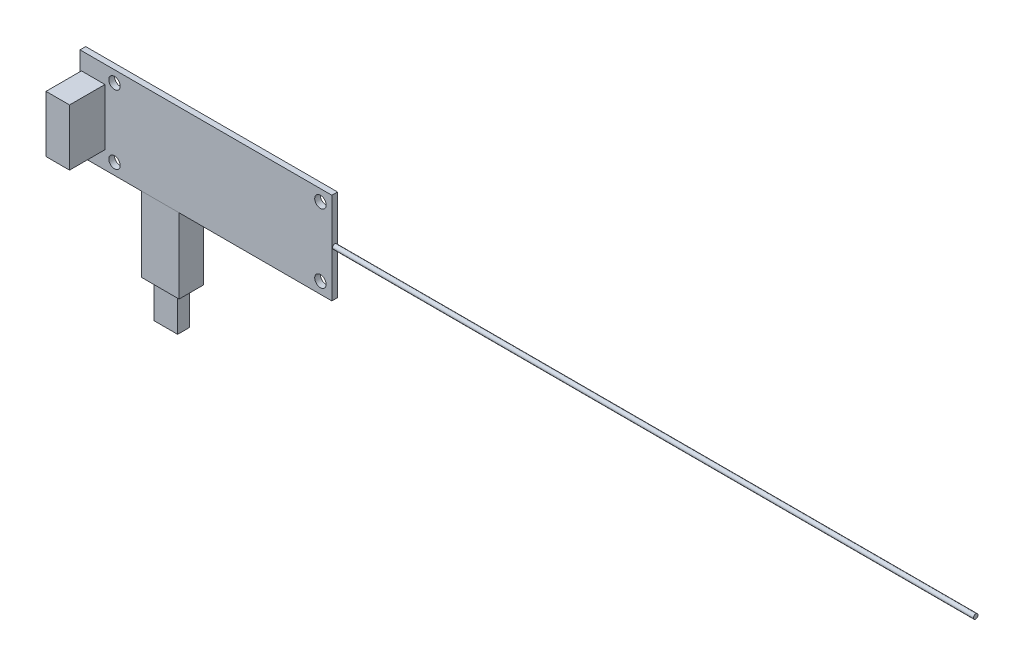
ISO-10303-21;
HEADER;
FILE_DESCRIPTION(('STEP AP214'),'2;1');
FILE_NAME('part.step','',(''),(''),'','','');
FILE_SCHEMA(('AUTOMOTIVE_DESIGN { 1 0 10303 214 1 1 1 1 }'));
ENDSEC;
DATA;
#1=APPLICATION_CONTEXT('core data for automotive mechanical design processes');
#2=APPLICATION_PROTOCOL_DEFINITION('international standard','automotive_design',2000,#1);
#3=PRODUCT_CONTEXT('',#1,'mechanical');
#4=PRODUCT('Part','Part','',(#3));
#5=PRODUCT_RELATED_PRODUCT_CATEGORY('part','',(#4));
#6=PRODUCT_DEFINITION_FORMATION('','',#4);
#7=PRODUCT_DEFINITION_CONTEXT('part definition',#1,'design');
#8=PRODUCT_DEFINITION('design','',#6,#7);
#9=PRODUCT_DEFINITION_SHAPE('','',#8);
#10=(LENGTH_UNIT() NAMED_UNIT(*) SI_UNIT(.MILLI.,.METRE.));
#11=(NAMED_UNIT(*) PLANE_ANGLE_UNIT() SI_UNIT($,.RADIAN.));
#12=(NAMED_UNIT(*) SI_UNIT($,.STERADIAN.) SOLID_ANGLE_UNIT());
#13=UNCERTAINTY_MEASURE_WITH_UNIT(LENGTH_MEASURE(1.E-05),#10,'distance_accuracy_value','');
#14=(GEOMETRIC_REPRESENTATION_CONTEXT(3) GLOBAL_UNCERTAINTY_ASSIGNED_CONTEXT((#13)) GLOBAL_UNIT_ASSIGNED_CONTEXT((#10,
#11,#12)) REPRESENTATION_CONTEXT('',''));
#15=CARTESIAN_POINT('',(0.,0.,0.));
#16=DIRECTION('',(0.,0.,1.));
#17=DIRECTION('',(1.,0.,0.));
#18=AXIS2_PLACEMENT_3D('',#15,#16,#17);
#19=CARTESIAN_POINT('',(34.925,12.7,1.5748));
#20=DIRECTION('',(0.,0.,-1.));
#21=DIRECTION('',(-1.,0.,0.));
#22=AXIS2_PLACEMENT_3D('',#19,#20,#21);
#23=PLANE('',#22);
#24=DIRECTION('',(0.,1.,0.));
#25=VECTOR('',#24,1.);
#26=CARTESIAN_POINT('',(34.925,-12.7,1.5748));
#27=LINE('',#26,#25);
#28=CARTESIAN_POINT('',(34.925,-12.7,1.5748));
#29=VERTEX_POINT('',#28);
#30=CARTESIAN_POINT('',(34.925,12.7,1.5748));
#31=VERTEX_POINT('',#30);
#32=EDGE_CURVE('E316',#29,#31,#27,.T.);
#33=ORIENTED_EDGE('',*,*,#32,.T.);
#34=DIRECTION('',(-1.,0.,0.));
#35=VECTOR('',#34,1.);
#36=CARTESIAN_POINT('',(-34.925,12.7,1.5748));
#37=LINE('',#36,#35);
#38=CARTESIAN_POINT('',(-34.925,12.7,1.5748));
#39=VERTEX_POINT('',#38);
#40=EDGE_CURVE('E354',#31,#39,#37,.T.);
#41=ORIENTED_EDGE('',*,*,#40,.T.);
#42=DIRECTION('',(0.,-1.,0.));
#43=VECTOR('',#42,1.);
#44=CARTESIAN_POINT('',(-34.925,-12.7,1.5748));
#45=LINE('',#44,#43);
#46=CARTESIAN_POINT('',(-34.925,-12.7,1.5748));
#47=VERTEX_POINT('',#46);
#48=EDGE_CURVE('E350',#39,#47,#45,.T.);
#49=ORIENTED_EDGE('',*,*,#48,.T.);
#50=DIRECTION('',(1.,0.,0.));
#51=VECTOR('',#50,1.);
#52=CARTESIAN_POINT('',(-34.925,-12.7,1.5748));
#53=LINE('',#52,#51);
#54=EDGE_CURVE('E344',#47,#29,#53,.T.);
#55=ORIENTED_EDGE('',*,*,#54,.T.);
#56=EDGE_LOOP('',(#33,#41,#49,#55));
#57=FACE_BOUND('',#56,.T.);
#58=CARTESIAN_POINT('',(31.75,9.525,1.5748));
#59=DIRECTION('',(0.,0.,1.));
#60=DIRECTION('',(1.,0.,0.));
#61=AXIS2_PLACEMENT_3D('',#58,#59,#60);
#62=CIRCLE('',#61,1.5875);
#63=CARTESIAN_POINT('',(33.3375,9.525,1.5748));
#64=VERTEX_POINT('',#63);
#65=EDGE_CURVE('E332',#64,#64,#62,.T.);
#66=ORIENTED_EDGE('',*,*,#65,.F.);
#67=EDGE_LOOP('',(#66));
#68=FACE_BOUND('',#67,.T.);
#69=CARTESIAN_POINT('',(-25.38222,9.525,1.5748));
#70=DIRECTION('',(0.,0.,1.));
#71=DIRECTION('',(1.,0.,0.));
#72=AXIS2_PLACEMENT_3D('',#69,#70,#71);
#73=CIRCLE('',#72,1.5875);
#74=CARTESIAN_POINT('',(-23.79472,9.525,1.5748));
#75=VERTEX_POINT('',#74);
#76=EDGE_CURVE('E328',#75,#75,#73,.T.);
#77=ORIENTED_EDGE('',*,*,#76,.F.);
#78=EDGE_LOOP('',(#77));
#79=FACE_BOUND('',#78,.T.);
#80=CARTESIAN_POINT('',(31.75,-9.525,1.5748));
#81=DIRECTION('',(0.,0.,1.));
#82=DIRECTION('',(1.,0.,0.));
#83=AXIS2_PLACEMENT_3D('',#80,#81,#82);
#84=CIRCLE('',#83,1.5875);
#85=CARTESIAN_POINT('',(33.3375,-9.525,1.5748));
#86=VERTEX_POINT('',#85);
#87=EDGE_CURVE('E323',#86,#86,#84,.T.);
#88=ORIENTED_EDGE('',*,*,#87,.F.);
#89=EDGE_LOOP('',(#88));
#90=FACE_BOUND('',#89,.T.);
#91=CARTESIAN_POINT('',(-25.38222,-9.525,1.5748));
#92=DIRECTION('',(0.,0.,1.));
#93=DIRECTION('',(1.,0.,0.));
#94=AXIS2_PLACEMENT_3D('',#91,#92,#93);
#95=CIRCLE('',#94,1.5875);
#96=CARTESIAN_POINT('',(-23.79472,-9.525,1.5748));
#97=VERTEX_POINT('',#96);
#98=EDGE_CURVE('E324',#97,#97,#95,.T.);
#99=ORIENTED_EDGE('',*,*,#98,.F.);
#100=EDGE_LOOP('',(#99));
#101=FACE_BOUND('',#100,.T.);
#102=DIRECTION('',(0.,1.,0.));
#103=VECTOR('',#102,1.);
#104=CARTESIAN_POINT('',(-28.0162,7.83589999999999,1.5748));
#105=LINE('',#104,#103);
#106=CARTESIAN_POINT('',(-28.0162,-7.8359,1.5748));
#107=VERTEX_POINT('',#106);
#108=CARTESIAN_POINT('',(-28.0162,7.83589999999999,1.5748));
#109=VERTEX_POINT('',#108);
#110=EDGE_CURVE('E202',#107,#109,#105,.T.);
#111=ORIENTED_EDGE('',*,*,#110,.F.);
#112=DIRECTION('',(1.,0.,0.));
#113=VECTOR('',#112,1.);
#114=CARTESIAN_POINT('',(-34.544,-7.8359,1.5748));
#115=LINE('',#114,#113);
#116=CARTESIAN_POINT('',(-34.544,-7.8359,1.5748));
#117=VERTEX_POINT('',#116);
#118=EDGE_CURVE('E199',#117,#107,#115,.T.);
#119=ORIENTED_EDGE('',*,*,#118,.F.);
#120=DIRECTION('',(0.,-1.,0.));
#121=VECTOR('',#120,1.);
#122=CARTESIAN_POINT('',(-34.544,7.83589999999999,1.5748));
#123=LINE('',#122,#121);
#124=CARTESIAN_POINT('',(-34.544,7.83589999999999,1.5748));
#125=VERTEX_POINT('',#124);
#126=EDGE_CURVE('E59',#125,#117,#123,.T.);
#127=ORIENTED_EDGE('',*,*,#126,.F.);
#128=DIRECTION('',(-1.,0.,0.));
#129=VECTOR('',#128,1.);
#130=CARTESIAN_POINT('',(-34.544,7.83589999999999,1.5748));
#131=LINE('',#130,#129);
#132=EDGE_CURVE('E54',#109,#125,#131,.T.);
#133=ORIENTED_EDGE('',*,*,#132,.F.);
#134=EDGE_LOOP('',(#111,#119,#127,#133));
#135=FACE_BOUND('',#134,.T.);
#136=ADVANCED_FACE('F35',(#57,#68,#79,#90,#101,#135),#23,.F.);
#137=CARTESIAN_POINT('',(0.,-33.528,0.));
#138=DIRECTION('',(0.,-1.,0.));
#139=DIRECTION('',(0.,0.,-1.));
#140=AXIS2_PLACEMENT_3D('',#137,#138,#139);
#141=PLANE('',#140);
#142=DIRECTION('',(0.,0.,1.));
#143=VECTOR('',#142,1.);
#144=CARTESIAN_POINT('',(-7.54803992820285,-33.528,1.48345392174432));
#145=LINE('',#144,#143);
#146=CARTESIAN_POINT('',(-7.54803992820285,-33.528,-5.29840618263377));
#147=VERTEX_POINT('',#146);
#148=CARTESIAN_POINT('',(-7.54803992820285,-33.528,1.48345392174432));
#149=VERTEX_POINT('',#148);
#150=EDGE_CURVE('E237',#147,#149,#145,.T.);
#151=ORIENTED_EDGE('',*,*,#150,.T.);
#152=DIRECTION('',(-1.,0.,0.));
#153=VECTOR('',#152,1.);
#154=CARTESIAN_POINT('',(-17.954432078227,-33.528,1.48345392174432));
#155=LINE('',#154,#153);
#156=CARTESIAN_POINT('',(-17.954432078227,-33.528,1.48345392174432));
#157=VERTEX_POINT('',#156);
#158=EDGE_CURVE('E240',#149,#157,#155,.T.);
#159=ORIENTED_EDGE('',*,*,#158,.T.);
#160=DIRECTION('',(0.,0.,-1.));
#161=VECTOR('',#160,1.);
#162=CARTESIAN_POINT('',(-17.954432078227,-33.528,1.48345392174432));
#163=LINE('',#162,#161);
#164=CARTESIAN_POINT('',(-17.954432078227,-33.528,-5.29840618263377));
#165=VERTEX_POINT('',#164);
#166=EDGE_CURVE('E243',#157,#165,#163,.T.);
#167=ORIENTED_EDGE('',*,*,#166,.T.);
#168=DIRECTION('',(1.,0.,0.));
#169=VECTOR('',#168,1.);
#170=CARTESIAN_POINT('',(-17.954432078227,-33.528,-5.29840618263377));
#171=LINE('',#170,#169);
#172=EDGE_CURVE('E245',#165,#147,#171,.T.);
#173=ORIENTED_EDGE('',*,*,#172,.T.);
#174=EDGE_LOOP('',(#151,#159,#167,#173));
#175=FACE_BOUND('',#174,.T.);
#176=DIRECTION('',(-1.,0.,0.));
#177=VECTOR('',#176,1.);
#178=CARTESIAN_POINT('',(-16.0158343043832,-33.528,3.33915384231886E-05));
#179=LINE('',#178,#177);
#180=CARTESIAN_POINT('',(-9.43013035592344,-33.528,3.33915384231886E-05));
#181=VERTEX_POINT('',#180);
#182=CARTESIAN_POINT('',(-16.0158343043832,-33.528,3.33915384231886E-05));
#183=VERTEX_POINT('',#182);
#184=EDGE_CURVE('E206',#181,#183,#179,.T.);
#185=ORIENTED_EDGE('',*,*,#184,.F.);
#186=DIRECTION('',(0.,0.,1.));
#187=VECTOR('',#186,1.);
#188=CARTESIAN_POINT('',(-9.43013035592344,-33.528,3.33915384231886E-05));
#189=LINE('',#188,#187);
#190=CARTESIAN_POINT('',(-9.43013035592344,-33.528,-3.25722561576836));
#191=VERTEX_POINT('',#190);
#192=EDGE_CURVE('E203',#191,#181,#189,.T.);
#193=ORIENTED_EDGE('',*,*,#192,.F.);
#194=DIRECTION('',(1.,0.,0.));
#195=VECTOR('',#194,1.);
#196=CARTESIAN_POINT('',(-16.0158343043832,-33.528,-3.25722561576836));
#197=LINE('',#196,#195);
#198=CARTESIAN_POINT('',(-16.0158343043832,-33.528,-3.25722561576836));
#199=VERTEX_POINT('',#198);
#200=EDGE_CURVE('E216',#199,#191,#197,.T.);
#201=ORIENTED_EDGE('',*,*,#200,.F.);
#202=DIRECTION('',(0.,0.,-1.));
#203=VECTOR('',#202,1.);
#204=CARTESIAN_POINT('',(-16.0158343043832,-33.528,3.33915384231886E-05));
#205=LINE('',#204,#203);
#206=EDGE_CURVE('E224',#183,#199,#205,.T.);
#207=ORIENTED_EDGE('',*,*,#206,.F.);
#208=EDGE_LOOP('',(#185,#193,#201,#207));
#209=FACE_BOUND('',#208,.T.);
#210=ADVANCED_FACE('F393',(#175,#209),#141,.T.);
#211=CARTESIAN_POINT('',(-34.925,-12.7,1.5748));
#212=DIRECTION('',(0.,1.,0.));
#213=DIRECTION('',(0.,0.,1.));
#214=AXIS2_PLACEMENT_3D('',#211,#212,#213);
#215=PLANE('',#214);
#216=DIRECTION('',(0.,0.,1.));
#217=VECTOR('',#216,1.);
#218=CARTESIAN_POINT('',(-7.54803992820285,-12.7,1.48345392174432));
#219=LINE('',#218,#217);
#220=CARTESIAN_POINT('',(-7.54803992820285,-12.7,0.));
#221=VERTEX_POINT('',#220);
#222=CARTESIAN_POINT('',(-7.54803992820285,-12.7,1.48345392174432));
#223=VERTEX_POINT('',#222);
#224=EDGE_CURVE('E11',#221,#223,#219,.T.);
#225=ORIENTED_EDGE('',*,*,#224,.F.);
#226=DIRECTION('',(1.,0.,0.));
#227=VECTOR('',#226,1.);
#228=CARTESIAN_POINT('',(-34.925,-12.7,0.));
#229=LINE('',#228,#227);
#230=CARTESIAN_POINT('',(34.925,-12.7,0.));
#231=VERTEX_POINT('',#230);
#232=EDGE_CURVE('E39',#221,#231,#229,.T.);
#233=ORIENTED_EDGE('',*,*,#232,.T.);
#234=DIRECTION('',(0.,0.,-1.));
#235=VECTOR('',#234,1.);
#236=CARTESIAN_POINT('',(34.925,-12.7,1.5748));
#237=LINE('',#236,#235);
#238=EDGE_CURVE('E306',#29,#231,#237,.T.);
#239=ORIENTED_EDGE('',*,*,#238,.F.);
#240=ORIENTED_EDGE('',*,*,#54,.F.);
#241=DIRECTION('',(0.,0.,-1.));
#242=VECTOR('',#241,1.);
#243=CARTESIAN_POINT('',(-34.925,-12.7,1.5748));
#244=LINE('',#243,#242);
#245=CARTESIAN_POINT('',(-34.925,-12.7,0.));
#246=VERTEX_POINT('',#245);
#247=EDGE_CURVE('E337',#47,#246,#244,.T.);
#248=ORIENTED_EDGE('',*,*,#247,.T.);
#249=CARTESIAN_POINT('',(-17.954432078227,-12.7,0.));
#250=VERTEX_POINT('',#249);
#251=EDGE_CURVE('E299',#246,#250,#229,.T.);
#252=ORIENTED_EDGE('',*,*,#251,.T.);
#253=DIRECTION('',(0.,0.,-1.));
#254=VECTOR('',#253,1.);
#255=CARTESIAN_POINT('',(-17.954432078227,-12.7,1.48345392174432));
#256=LINE('',#255,#254);
#257=CARTESIAN_POINT('',(-17.954432078227,-12.7,1.48345392174432));
#258=VERTEX_POINT('',#257);
#259=EDGE_CURVE('E253',#258,#250,#256,.T.);
#260=ORIENTED_EDGE('',*,*,#259,.F.);
#261=DIRECTION('',(-1.,0.,0.));
#262=VECTOR('',#261,1.);
#263=CARTESIAN_POINT('',(-17.954432078227,-12.7,1.48345392174432));
#264=LINE('',#263,#262);
#265=EDGE_CURVE('E249',#223,#258,#264,.T.);
#266=ORIENTED_EDGE('',*,*,#265,.F.);
#267=EDGE_LOOP('',(#225,#233,#239,#240,#248,#252,#260,#266));
#268=FACE_BOUND('',#267,.T.);
#269=ADVANCED_FACE('F389',(#268),#215,.F.);
#270=CARTESIAN_POINT('',(34.925,-12.7,1.5748));
#271=DIRECTION('',(-1.,0.,0.));
#272=DIRECTION('',(0.,0.,1.));
#273=AXIS2_PLACEMENT_3D('',#270,#271,#272);
#274=PLANE('',#273);
#275=DIRECTION('',(0.,1.,0.));
#276=VECTOR('',#275,1.);
#277=CARTESIAN_POINT('',(34.925,-12.7,0.));
#278=LINE('',#277,#276);
#279=CARTESIAN_POINT('',(34.925,12.7,0.));
#280=VERTEX_POINT('',#279);
#281=EDGE_CURVE('E358',#231,#280,#278,.T.);
#282=ORIENTED_EDGE('',*,*,#281,.T.);
#283=DIRECTION('',(0.,0.,-1.));
#284=VECTOR('',#283,1.);
#285=CARTESIAN_POINT('',(34.925,12.7,1.5748));
#286=LINE('',#285,#284);
#287=EDGE_CURVE('E319',#31,#280,#286,.T.);
#288=ORIENTED_EDGE('',*,*,#287,.F.);
#289=ORIENTED_EDGE('',*,*,#32,.F.);
#290=ORIENTED_EDGE('',*,*,#238,.T.);
#291=EDGE_LOOP('',(#282,#288,#289,#290));
#292=FACE_BOUND('',#291,.T.);
#293=CARTESIAN_POINT('',(34.925,0.,0.772028936154356));
#294=DIRECTION('',(-1.,0.,0.));
#295=DIRECTION('',(0.,0.,1.));
#296=AXIS2_PLACEMENT_3D('',#293,#294,#295);
#297=CIRCLE('',#296,0.635);
#298=CARTESIAN_POINT('',(34.925,0.,1.40702893615436));
#299=VERTEX_POINT('',#298);
#300=EDGE_CURVE('E45',#299,#299,#297,.F.);
#301=ORIENTED_EDGE('',*,*,#300,.F.);
#302=EDGE_LOOP('',(#301));
#303=FACE_BOUND('',#302,.T.);
#304=ADVANCED_FACE('F37',(#292,#303),#274,.F.);
#305=CARTESIAN_POINT('',(-34.925,12.7,1.5748));
#306=DIRECTION('',(0.,-1.,0.));
#307=DIRECTION('',(0.,0.,-1.));
#308=AXIS2_PLACEMENT_3D('',#305,#306,#307);
#309=PLANE('',#308);
#310=DIRECTION('',(-1.,0.,0.));
#311=VECTOR('',#310,1.);
#312=CARTESIAN_POINT('',(-34.925,12.7,0.));
#313=LINE('',#312,#311);
#314=CARTESIAN_POINT('',(-34.925,12.7,0.));
#315=VERTEX_POINT('',#314);
#316=EDGE_CURVE('E359',#280,#315,#313,.T.);
#317=ORIENTED_EDGE('',*,*,#316,.T.);
#318=DIRECTION('',(0.,0.,-1.));
#319=VECTOR('',#318,1.);
#320=CARTESIAN_POINT('',(-34.925,12.7,1.5748));
#321=LINE('',#320,#319);
#322=EDGE_CURVE('E335',#39,#315,#321,.T.);
#323=ORIENTED_EDGE('',*,*,#322,.F.);
#324=ORIENTED_EDGE('',*,*,#40,.F.);
#325=ORIENTED_EDGE('',*,*,#287,.T.);
#326=EDGE_LOOP('',(#317,#323,#324,#325));
#327=FACE_BOUND('',#326,.T.);
#328=ADVANCED_FACE('F444',(#327),#309,.F.);
#329=CARTESIAN_POINT('',(-34.925,-12.7,1.5748));
#330=DIRECTION('',(1.,0.,0.));
#331=DIRECTION('',(0.,0.,-1.));
#332=AXIS2_PLACEMENT_3D('',#329,#330,#331);
#333=PLANE('',#332);
#334=DIRECTION('',(0.,-1.,0.));
#335=VECTOR('',#334,1.);
#336=CARTESIAN_POINT('',(-34.925,-12.7,0.));
#337=LINE('',#336,#335);
#338=EDGE_CURVE('E304',#315,#246,#337,.T.);
#339=ORIENTED_EDGE('',*,*,#338,.T.);
#340=ORIENTED_EDGE('',*,*,#247,.F.);
#341=ORIENTED_EDGE('',*,*,#48,.F.);
#342=ORIENTED_EDGE('',*,*,#322,.T.);
#343=EDGE_LOOP('',(#339,#340,#341,#342));
#344=FACE_BOUND('',#343,.T.);
#345=ADVANCED_FACE('F440',(#344),#333,.F.);
#346=CARTESIAN_POINT('',(34.925,12.7,0.));
#347=DIRECTION('',(0.,0.,-1.));
#348=DIRECTION('',(-1.,0.,0.));
#349=AXIS2_PLACEMENT_3D('',#346,#347,#348);
#350=PLANE('',#349);
#351=DIRECTION('',(0.,1.,0.));
#352=VECTOR('',#351,1.);
#353=CARTESIAN_POINT('',(-17.1360662289999,-12.7,0.));
#354=LINE('',#353,#352);
#355=CARTESIAN_POINT('',(-17.1360662289999,-12.7,0.));
#356=VERTEX_POINT('',#355);
#357=CARTESIAN_POINT('',(-17.1360662289999,-3.9624,0.));
#358=VERTEX_POINT('',#357);
#359=EDGE_CURVE('E268',#356,#358,#354,.T.);
#360=ORIENTED_EDGE('',*,*,#359,.F.);
#361=EDGE_CURVE('E297',#250,#356,#229,.T.);
#362=ORIENTED_EDGE('',*,*,#361,.F.);
#363=ORIENTED_EDGE('',*,*,#251,.F.);
#364=ORIENTED_EDGE('',*,*,#338,.F.);
#365=ORIENTED_EDGE('',*,*,#316,.F.);
#366=ORIENTED_EDGE('',*,*,#281,.F.);
#367=ORIENTED_EDGE('',*,*,#232,.F.);
#368=CARTESIAN_POINT('',(-9.00806622899988,-12.7,0.));
#369=VERTEX_POINT('',#368);
#370=EDGE_CURVE('E300',#369,#221,#229,.T.);
#371=ORIENTED_EDGE('',*,*,#370,.F.);
#372=DIRECTION('',(0.,-1.,0.));
#373=VECTOR('',#372,1.);
#374=CARTESIAN_POINT('',(-9.00806622899988,-12.7,0.));
#375=LINE('',#374,#373);
#376=CARTESIAN_POINT('',(-9.00806622899988,-3.9624,0.));
#377=VERTEX_POINT('',#376);
#378=EDGE_CURVE('E273',#377,#369,#375,.T.);
#379=ORIENTED_EDGE('',*,*,#378,.F.);
#380=DIRECTION('',(1.,0.,0.));
#381=VECTOR('',#380,1.);
#382=CARTESIAN_POINT('',(-17.1360662289999,-3.9624,0.));
#383=LINE('',#382,#381);
#384=EDGE_CURVE('E280',#358,#377,#383,.T.);
#385=ORIENTED_EDGE('',*,*,#384,.F.);
#386=EDGE_LOOP('',(#360,#362,#363,#364,#365,#366,#367,#371,#379,#385));
#387=FACE_BOUND('',#386,.T.);
#388=CARTESIAN_POINT('',(-25.38222,-9.525,0.));
#389=DIRECTION('',(0.,0.,-1.));
#390=DIRECTION('',(-1.,0.,0.));
#391=AXIS2_PLACEMENT_3D('',#388,#389,#390);
#392=CIRCLE('',#391,1.5875);
#393=CARTESIAN_POINT('',(-26.96972,-9.525,0.));
#394=VERTEX_POINT('',#393);
#395=EDGE_CURVE('E320',#394,#394,#392,.T.);
#396=ORIENTED_EDGE('',*,*,#395,.F.);
#397=EDGE_LOOP('',(#396));
#398=FACE_BOUND('',#397,.T.);
#399=CARTESIAN_POINT('',(31.75,-9.525,0.));
#400=DIRECTION('',(0.,0.,-1.));
#401=DIRECTION('',(-1.,0.,0.));
#402=AXIS2_PLACEMENT_3D('',#399,#400,#401);
#403=CIRCLE('',#402,1.5875);
#404=CARTESIAN_POINT('',(30.1625,-9.525,0.));
#405=VERTEX_POINT('',#404);
#406=EDGE_CURVE('E325',#405,#405,#403,.T.);
#407=ORIENTED_EDGE('',*,*,#406,.F.);
#408=EDGE_LOOP('',(#407));
#409=FACE_BOUND('',#408,.T.);
#410=CARTESIAN_POINT('',(-25.38222,9.525,0.));
#411=DIRECTION('',(0.,0.,-1.));
#412=DIRECTION('',(-1.,0.,0.));
#413=AXIS2_PLACEMENT_3D('',#410,#411,#412);
#414=CIRCLE('',#413,1.5875);
#415=CARTESIAN_POINT('',(-26.96972,9.525,0.));
#416=VERTEX_POINT('',#415);
#417=EDGE_CURVE('E329',#416,#416,#414,.T.);
#418=ORIENTED_EDGE('',*,*,#417,.F.);
#419=EDGE_LOOP('',(#418));
#420=FACE_BOUND('',#419,.T.);
#421=CARTESIAN_POINT('',(31.75,9.525,0.));
#422=DIRECTION('',(0.,0.,-1.));
#423=DIRECTION('',(-1.,0.,0.));
#424=AXIS2_PLACEMENT_3D('',#421,#422,#423);
#425=CIRCLE('',#424,1.5875);
#426=CARTESIAN_POINT('',(30.1625,9.525,0.));
#427=VERTEX_POINT('',#426);
#428=EDGE_CURVE('E360',#427,#427,#425,.T.);
#429=ORIENTED_EDGE('',*,*,#428,.F.);
#430=EDGE_LOOP('',(#429));
#431=FACE_BOUND('',#430,.T.);
#432=ADVANCED_FACE('F437',(#387,#398,#409,#420,#431),#350,.T.);
#433=CARTESIAN_POINT('',(31.75,9.525,1.5748));
#434=DIRECTION('',(0.,0.,1.));
#435=DIRECTION('',(1.,0.,0.));
#436=AXIS2_PLACEMENT_3D('',#433,#434,#435);
#437=CYLINDRICAL_SURFACE('',#436,1.5875);
#438=ORIENTED_EDGE('',*,*,#428,.T.);
#439=EDGE_LOOP('',(#438));
#440=FACE_BOUND('',#439,.T.);
#441=ORIENTED_EDGE('',*,*,#65,.T.);
#442=EDGE_LOOP('',(#441));
#443=FACE_BOUND('',#442,.T.);
#444=ADVANCED_FACE('F435',(#440,#443),#437,.F.);
#445=CARTESIAN_POINT('',(-25.38222,9.525,1.5748));
#446=DIRECTION('',(0.,0.,1.));
#447=DIRECTION('',(1.,0.,0.));
#448=AXIS2_PLACEMENT_3D('',#445,#446,#447);
#449=CYLINDRICAL_SURFACE('',#448,1.5875);
#450=ORIENTED_EDGE('',*,*,#417,.T.);
#451=EDGE_LOOP('',(#450));
#452=FACE_BOUND('',#451,.T.);
#453=ORIENTED_EDGE('',*,*,#76,.T.);
#454=EDGE_LOOP('',(#453));
#455=FACE_BOUND('',#454,.T.);
#456=ADVANCED_FACE('F475',(#452,#455),#449,.F.);
#457=CARTESIAN_POINT('',(31.75,-9.525,1.5748));
#458=DIRECTION('',(0.,0.,1.));
#459=DIRECTION('',(1.,0.,0.));
#460=AXIS2_PLACEMENT_3D('',#457,#458,#459);
#461=CYLINDRICAL_SURFACE('',#460,1.5875);
#462=ORIENTED_EDGE('',*,*,#406,.T.);
#463=EDGE_LOOP('',(#462));
#464=FACE_BOUND('',#463,.T.);
#465=ORIENTED_EDGE('',*,*,#87,.T.);
#466=EDGE_LOOP('',(#465));
#467=FACE_BOUND('',#466,.T.);
#468=ADVANCED_FACE('F468',(#464,#467),#461,.F.);
#469=CARTESIAN_POINT('',(-25.38222,-9.525,1.5748));
#470=DIRECTION('',(0.,0.,1.));
#471=DIRECTION('',(1.,0.,0.));
#472=AXIS2_PLACEMENT_3D('',#469,#470,#471);
#473=CYLINDRICAL_SURFACE('',#472,1.5875);
#474=ORIENTED_EDGE('',*,*,#395,.T.);
#475=EDGE_LOOP('',(#474));
#476=FACE_BOUND('',#475,.T.);
#477=ORIENTED_EDGE('',*,*,#98,.T.);
#478=EDGE_LOOP('',(#477));
#479=FACE_BOUND('',#478,.T.);
#480=ADVANCED_FACE('F458',(#476,#479),#473,.F.);
#481=CARTESIAN_POINT('',(212.725,0.,0.772028936154356));
#482=DIRECTION('',(-1.,0.,0.));
#483=DIRECTION('',(0.,0.,1.));
#484=AXIS2_PLACEMENT_3D('',#481,#482,#483);
#485=CYLINDRICAL_SURFACE('',#484,0.635);
#486=CARTESIAN_POINT('',(212.725,0.,0.772028936154356));
#487=DIRECTION('',(1.,0.,0.));
#488=DIRECTION('',(0.,0.,-1.));
#489=AXIS2_PLACEMENT_3D('',#486,#487,#488);
#490=CIRCLE('',#489,0.635);
#491=CARTESIAN_POINT('',(212.725,0.,0.137028936154356));
#492=VERTEX_POINT('',#491);
#493=EDGE_CURVE('E516',#492,#492,#490,.T.);
#494=ORIENTED_EDGE('',*,*,#493,.F.);
#495=EDGE_LOOP('',(#494));
#496=FACE_BOUND('',#495,.T.);
#497=ORIENTED_EDGE('',*,*,#300,.T.);
#498=EDGE_LOOP('',(#497));
#499=FACE_BOUND('',#498,.T.);
#500=ADVANCED_FACE('F455',(#496,#499),#485,.T.);
#501=CARTESIAN_POINT('',(212.725,0.,0.772028936154356));
#502=DIRECTION('',(1.,0.,0.));
#503=DIRECTION('',(0.,0.,-1.));
#504=AXIS2_PLACEMENT_3D('',#501,#502,#503);
#505=PLANE('',#504);
#506=ORIENTED_EDGE('',*,*,#493,.T.);
#507=EDGE_LOOP('',(#506));
#508=FACE_BOUND('',#507,.T.);
#509=ADVANCED_FACE('F457',(#508),#505,.T.);
#510=CARTESIAN_POINT('',(-17.1360662289999,-12.7,-4.1402));
#511=DIRECTION('',(1.,0.,0.));
#512=DIRECTION('',(0.,0.,-1.));
#513=AXIS2_PLACEMENT_3D('',#510,#511,#512);
#514=PLANE('',#513);
#515=ORIENTED_EDGE('',*,*,#359,.T.);
#516=DIRECTION('',(0.,0.,1.));
#517=VECTOR('',#516,1.);
#518=CARTESIAN_POINT('',(-17.1360662289999,-3.9624,-4.1402));
#519=LINE('',#518,#517);
#520=CARTESIAN_POINT('',(-17.1360662289999,-3.9624,-4.1402));
#521=VERTEX_POINT('',#520);
#522=EDGE_CURVE('E515',#521,#358,#519,.T.);
#523=ORIENTED_EDGE('',*,*,#522,.F.);
#524=DIRECTION('',(0.,1.,0.));
#525=VECTOR('',#524,1.);
#526=CARTESIAN_POINT('',(-17.1360662289999,-12.7,-4.1402));
#527=LINE('',#526,#525);
#528=CARTESIAN_POINT('',(-17.1360662289999,-12.7,-4.1402));
#529=VERTEX_POINT('',#528);
#530=EDGE_CURVE('E269',#529,#521,#527,.T.);
#531=ORIENTED_EDGE('',*,*,#530,.F.);
#532=DIRECTION('',(0.,0.,1.));
#533=VECTOR('',#532,1.);
#534=CARTESIAN_POINT('',(-17.1360662289999,-12.7,-4.1402));
#535=LINE('',#534,#533);
#536=EDGE_CURVE('E279',#529,#356,#535,.T.);
#537=ORIENTED_EDGE('',*,*,#536,.T.);
#538=EDGE_LOOP('',(#515,#523,#531,#537));
#539=FACE_BOUND('',#538,.T.);
#540=ADVANCED_FACE('F465',(#539),#514,.F.);
#541=CARTESIAN_POINT('',(-17.1360662289999,-3.9624,-4.1402));
#542=DIRECTION('',(0.,-1.,0.));
#543=DIRECTION('',(1.,0.,0.));
#544=AXIS2_PLACEMENT_3D('',#541,#542,#543);
#545=PLANE('',#544);
#546=ORIENTED_EDGE('',*,*,#384,.T.);
#547=DIRECTION('',(0.,0.,1.));
#548=VECTOR('',#547,1.);
#549=CARTESIAN_POINT('',(-9.00806622899988,-3.9624,-4.1402));
#550=LINE('',#549,#548);
#551=CARTESIAN_POINT('',(-9.00806622899988,-3.9624,-4.1402));
#552=VERTEX_POINT('',#551);
#553=EDGE_CURVE('E285',#552,#377,#550,.T.);
#554=ORIENTED_EDGE('',*,*,#553,.F.);
#555=DIRECTION('',(1.,0.,0.));
#556=VECTOR('',#555,1.);
#557=CARTESIAN_POINT('',(-17.1360662289999,-3.9624,-4.1402));
#558=LINE('',#557,#556);
#559=EDGE_CURVE('E272',#521,#552,#558,.T.);
#560=ORIENTED_EDGE('',*,*,#559,.F.);
#561=ORIENTED_EDGE('',*,*,#522,.T.);
#562=EDGE_LOOP('',(#546,#554,#560,#561));
#563=FACE_BOUND('',#562,.T.);
#564=ADVANCED_FACE('F514',(#563),#545,.F.);
#565=CARTESIAN_POINT('',(-9.00806622899988,-12.7,-4.1402));
#566=DIRECTION('',(-1.,0.,0.));
#567=DIRECTION('',(0.,0.,1.));
#568=AXIS2_PLACEMENT_3D('',#565,#566,#567);
#569=PLANE('',#568);
#570=ORIENTED_EDGE('',*,*,#378,.T.);
#571=DIRECTION('',(0.,0.,1.));
#572=VECTOR('',#571,1.);
#573=CARTESIAN_POINT('',(-9.00806622899988,-12.7,-4.1402));
#574=LINE('',#573,#572);
#575=CARTESIAN_POINT('',(-9.00806622899988,-12.7,-4.1402));
#576=VERTEX_POINT('',#575);
#577=EDGE_CURVE('E293',#576,#369,#574,.T.);
#578=ORIENTED_EDGE('',*,*,#577,.F.);
#579=DIRECTION('',(0.,-1.,0.));
#580=VECTOR('',#579,1.);
#581=CARTESIAN_POINT('',(-9.00806622899988,-12.7,-4.1402));
#582=LINE('',#581,#580);
#583=EDGE_CURVE('E275',#552,#576,#582,.T.);
#584=ORIENTED_EDGE('',*,*,#583,.F.);
#585=ORIENTED_EDGE('',*,*,#553,.T.);
#586=EDGE_LOOP('',(#570,#578,#584,#585));
#587=FACE_BOUND('',#586,.T.);
#588=ADVANCED_FACE('F512',(#587),#569,.F.);
#589=CARTESIAN_POINT('',(0.,0.,-4.1402));
#590=DIRECTION('',(0.,0.,-1.));
#591=DIRECTION('',(-1.,0.,0.));
#592=AXIS2_PLACEMENT_3D('',#589,#590,#591);
#593=PLANE('',#592);
#594=ORIENTED_EDGE('',*,*,#530,.T.);
#595=ORIENTED_EDGE('',*,*,#559,.T.);
#596=ORIENTED_EDGE('',*,*,#583,.T.);
#597=DIRECTION('',(-1.,0.,0.));
#598=VECTOR('',#597,1.);
#599=CARTESIAN_POINT('',(-17.1360662289999,-12.7,-4.1402));
#600=LINE('',#599,#598);
#601=EDGE_CURVE('E277',#576,#529,#600,.T.);
#602=ORIENTED_EDGE('',*,*,#601,.T.);
#603=EDGE_LOOP('',(#594,#595,#596,#602));
#604=FACE_BOUND('',#603,.T.);
#605=ADVANCED_FACE('F507',(#604),#593,.T.);
#606=CARTESIAN_POINT('',(0.,-12.7,0.));
#607=DIRECTION('',(0.,-1.,0.));
#608=DIRECTION('',(0.,0.,-1.));
#609=AXIS2_PLACEMENT_3D('',#606,#607,#608);
#610=PLANE('',#609);
#611=CARTESIAN_POINT('',(-17.954432078227,-12.7,-5.29840618263377));
#612=VERTEX_POINT('',#611);
#613=EDGE_CURVE('E252',#250,#612,#256,.T.);
#614=ORIENTED_EDGE('',*,*,#613,.F.);
#615=ORIENTED_EDGE('',*,*,#361,.T.);
#616=ORIENTED_EDGE('',*,*,#536,.F.);
#617=ORIENTED_EDGE('',*,*,#601,.F.);
#618=ORIENTED_EDGE('',*,*,#577,.T.);
#619=ORIENTED_EDGE('',*,*,#370,.T.);
#620=CARTESIAN_POINT('',(-7.54803992820285,-12.7,-5.29840618263377));
#621=VERTEX_POINT('',#620);
#622=EDGE_CURVE('E47',#621,#221,#219,.T.);
#623=ORIENTED_EDGE('',*,*,#622,.F.);
#624=DIRECTION('',(1.,0.,0.));
#625=VECTOR('',#624,1.);
#626=CARTESIAN_POINT('',(-17.954432078227,-12.7,-5.29840618263377));
#627=LINE('',#626,#625);
#628=EDGE_CURVE('E241',#612,#621,#627,.T.);
#629=ORIENTED_EDGE('',*,*,#628,.F.);
#630=EDGE_LOOP('',(#614,#615,#616,#617,#618,#619,#623,#629));
#631=FACE_BOUND('',#630,.T.);
#632=ADVANCED_FACE('F370',(#631),#610,.F.);
#633=CARTESIAN_POINT('',(-7.54803992820285,-33.528,1.48345392174432));
#634=DIRECTION('',(-1.,0.,0.));
#635=DIRECTION('',(0.,0.,1.));
#636=AXIS2_PLACEMENT_3D('',#633,#634,#635);
#637=PLANE('',#636);
#638=ORIENTED_EDGE('',*,*,#622,.T.);
#639=ORIENTED_EDGE('',*,*,#224,.T.);
#640=DIRECTION('',(0.,1.,0.));
#641=VECTOR('',#640,1.);
#642=CARTESIAN_POINT('',(-7.54803992820285,-33.528,1.48345392174432));
#643=LINE('',#642,#641);
#644=EDGE_CURVE('E265',#149,#223,#643,.T.);
#645=ORIENTED_EDGE('',*,*,#644,.F.);
#646=ORIENTED_EDGE('',*,*,#150,.F.);
#647=DIRECTION('',(0.,1.,0.));
#648=VECTOR('',#647,1.);
#649=CARTESIAN_POINT('',(-7.54803992820285,-33.528,-5.29840618263377));
#650=LINE('',#649,#648);
#651=EDGE_CURVE('E246',#147,#621,#650,.T.);
#652=ORIENTED_EDGE('',*,*,#651,.T.);
#653=EDGE_LOOP('',(#638,#639,#645,#646,#652));
#654=FACE_BOUND('',#653,.T.);
#655=ADVANCED_FACE('F376',(#654),#637,.F.);
#656=CARTESIAN_POINT('',(-17.954432078227,-33.528,1.48345392174432));
#657=DIRECTION('',(0.,0.,-1.));
#658=DIRECTION('',(-1.,0.,0.));
#659=AXIS2_PLACEMENT_3D('',#656,#657,#658);
#660=PLANE('',#659);
#661=ORIENTED_EDGE('',*,*,#265,.T.);
#662=DIRECTION('',(0.,1.,0.));
#663=VECTOR('',#662,1.);
#664=CARTESIAN_POINT('',(-17.954432078227,-33.528,1.48345392174432));
#665=LINE('',#664,#663);
#666=EDGE_CURVE('E262',#157,#258,#665,.T.);
#667=ORIENTED_EDGE('',*,*,#666,.F.);
#668=ORIENTED_EDGE('',*,*,#158,.F.);
#669=ORIENTED_EDGE('',*,*,#644,.T.);
#670=EDGE_LOOP('',(#661,#667,#668,#669));
#671=FACE_BOUND('',#670,.T.);
#672=ADVANCED_FACE('F391',(#671),#660,.F.);
#673=CARTESIAN_POINT('',(-17.954432078227,-33.528,1.48345392174432));
#674=DIRECTION('',(1.,0.,0.));
#675=DIRECTION('',(0.,0.,-1.));
#676=AXIS2_PLACEMENT_3D('',#673,#674,#675);
#677=PLANE('',#676);
#678=ORIENTED_EDGE('',*,*,#259,.T.);
#679=ORIENTED_EDGE('',*,*,#613,.T.);
#680=DIRECTION('',(0.,1.,0.));
#681=VECTOR('',#680,1.);
#682=CARTESIAN_POINT('',(-17.954432078227,-33.528,-5.29840618263377));
#683=LINE('',#682,#681);
#684=EDGE_CURVE('E259',#165,#612,#683,.T.);
#685=ORIENTED_EDGE('',*,*,#684,.F.);
#686=ORIENTED_EDGE('',*,*,#166,.F.);
#687=ORIENTED_EDGE('',*,*,#666,.T.);
#688=EDGE_LOOP('',(#678,#679,#685,#686,#687));
#689=FACE_BOUND('',#688,.T.);
#690=ADVANCED_FACE('F386',(#689),#677,.F.);
#691=CARTESIAN_POINT('',(-17.954432078227,-33.528,-5.29840618263377));
#692=DIRECTION('',(0.,0.,1.));
#693=DIRECTION('',(1.,0.,0.));
#694=AXIS2_PLACEMENT_3D('',#691,#692,#693);
#695=PLANE('',#694);
#696=ORIENTED_EDGE('',*,*,#628,.T.);
#697=ORIENTED_EDGE('',*,*,#651,.F.);
#698=ORIENTED_EDGE('',*,*,#172,.F.);
#699=ORIENTED_EDGE('',*,*,#684,.T.);
#700=EDGE_LOOP('',(#696,#697,#698,#699));
#701=FACE_BOUND('',#700,.T.);
#702=ADVANCED_FACE('F382',(#701),#695,.F.);
#703=CARTESIAN_POINT('',(-9.43013035592344,-43.688,3.33915384231886E-05));
#704=DIRECTION('',(-1.,0.,0.));
#705=DIRECTION('',(0.,0.,1.));
#706=AXIS2_PLACEMENT_3D('',#703,#704,#705);
#707=PLANE('',#706);
#708=ORIENTED_EDGE('',*,*,#192,.T.);
#709=DIRECTION('',(0.,1.,0.));
#710=VECTOR('',#709,1.);
#711=CARTESIAN_POINT('',(-9.43013035592344,-43.688,3.33915384231886E-05));
#712=LINE('',#711,#710);
#713=CARTESIAN_POINT('',(-9.43013035592344,-43.688,3.33915384231886E-05));
#714=VERTEX_POINT('',#713);
#715=EDGE_CURVE('E235',#714,#181,#712,.T.);
#716=ORIENTED_EDGE('',*,*,#715,.F.);
#717=DIRECTION('',(0.,0.,1.));
#718=VECTOR('',#717,1.);
#719=CARTESIAN_POINT('',(-9.43013035592344,-43.688,3.33915384231886E-05));
#720=LINE('',#719,#718);
#721=CARTESIAN_POINT('',(-9.43013035592344,-43.688,-3.25722561576836));
#722=VERTEX_POINT('',#721);
#723=EDGE_CURVE('E212',#722,#714,#720,.T.);
#724=ORIENTED_EDGE('',*,*,#723,.F.);
#725=DIRECTION('',(0.,1.,0.));
#726=VECTOR('',#725,1.);
#727=CARTESIAN_POINT('',(-9.43013035592344,-43.688,-3.25722561576836));
#728=LINE('',#727,#726);
#729=EDGE_CURVE('E221',#722,#191,#728,.T.);
#730=ORIENTED_EDGE('',*,*,#729,.T.);
#731=EDGE_LOOP('',(#708,#716,#724,#730));
#732=FACE_BOUND('',#731,.T.);
#733=ADVANCED_FACE('F415',(#732),#707,.F.);
#734=CARTESIAN_POINT('',(-16.0158343043832,-43.688,3.33915384231886E-05));
#735=DIRECTION('',(0.,0.,-1.));
#736=DIRECTION('',(-1.,0.,0.));
#737=AXIS2_PLACEMENT_3D('',#734,#735,#736);
#738=PLANE('',#737);
#739=ORIENTED_EDGE('',*,*,#184,.T.);
#740=DIRECTION('',(0.,1.,0.));
#741=VECTOR('',#740,1.);
#742=CARTESIAN_POINT('',(-16.0158343043832,-43.688,3.33915384231886E-05));
#743=LINE('',#742,#741);
#744=CARTESIAN_POINT('',(-16.0158343043832,-43.688,3.33915384231886E-05));
#745=VERTEX_POINT('',#744);
#746=EDGE_CURVE('E232',#745,#183,#743,.T.);
#747=ORIENTED_EDGE('',*,*,#746,.F.);
#748=DIRECTION('',(-1.,0.,0.));
#749=VECTOR('',#748,1.);
#750=CARTESIAN_POINT('',(-16.0158343043832,-43.688,3.33915384231886E-05));
#751=LINE('',#750,#749);
#752=EDGE_CURVE('E215',#714,#745,#751,.T.);
#753=ORIENTED_EDGE('',*,*,#752,.F.);
#754=ORIENTED_EDGE('',*,*,#715,.T.);
#755=EDGE_LOOP('',(#739,#747,#753,#754));
#756=FACE_BOUND('',#755,.T.);
#757=ADVANCED_FACE('F403',(#756),#738,.F.);
#758=CARTESIAN_POINT('',(-16.0158343043832,-43.688,3.33915384231886E-05));
#759=DIRECTION('',(1.,0.,0.));
#760=DIRECTION('',(0.,0.,-1.));
#761=AXIS2_PLACEMENT_3D('',#758,#759,#760);
#762=PLANE('',#761);
#763=ORIENTED_EDGE('',*,*,#206,.T.);
#764=DIRECTION('',(0.,1.,0.));
#765=VECTOR('',#764,1.);
#766=CARTESIAN_POINT('',(-16.0158343043832,-43.688,-3.25722561576836));
#767=LINE('',#766,#765);
#768=CARTESIAN_POINT('',(-16.0158343043832,-43.688,-3.25722561576836));
#769=VERTEX_POINT('',#768);
#770=EDGE_CURVE('E230',#769,#199,#767,.T.);
#771=ORIENTED_EDGE('',*,*,#770,.F.);
#772=DIRECTION('',(0.,0.,-1.));
#773=VECTOR('',#772,1.);
#774=CARTESIAN_POINT('',(-16.0158343043832,-43.688,3.33915384231886E-05));
#775=LINE('',#774,#773);
#776=EDGE_CURVE('E218',#745,#769,#775,.T.);
#777=ORIENTED_EDGE('',*,*,#776,.F.);
#778=ORIENTED_EDGE('',*,*,#746,.T.);
#779=EDGE_LOOP('',(#763,#771,#777,#778));
#780=FACE_BOUND('',#779,.T.);
#781=ADVANCED_FACE('F407',(#780),#762,.F.);
#782=CARTESIAN_POINT('',(-16.0158343043832,-43.688,-3.25722561576836));
#783=DIRECTION('',(0.,0.,1.));
#784=DIRECTION('',(1.,0.,0.));
#785=AXIS2_PLACEMENT_3D('',#782,#783,#784);
#786=PLANE('',#785);
#787=ORIENTED_EDGE('',*,*,#200,.T.);
#788=ORIENTED_EDGE('',*,*,#729,.F.);
#789=DIRECTION('',(1.,0.,0.));
#790=VECTOR('',#789,1.);
#791=CARTESIAN_POINT('',(-16.0158343043832,-43.688,-3.25722561576836));
#792=LINE('',#791,#790);
#793=EDGE_CURVE('E220',#769,#722,#792,.T.);
#794=ORIENTED_EDGE('',*,*,#793,.F.);
#795=ORIENTED_EDGE('',*,*,#770,.T.);
#796=EDGE_LOOP('',(#787,#788,#794,#795));
#797=FACE_BOUND('',#796,.T.);
#798=ADVANCED_FACE('F417',(#797),#786,.F.);
#799=CARTESIAN_POINT('',(0.,-43.688,0.));
#800=DIRECTION('',(0.,-1.,0.));
#801=DIRECTION('',(0.,0.,-1.));
#802=AXIS2_PLACEMENT_3D('',#799,#800,#801);
#803=PLANE('',#802);
#804=ORIENTED_EDGE('',*,*,#723,.T.);
#805=ORIENTED_EDGE('',*,*,#752,.T.);
#806=ORIENTED_EDGE('',*,*,#776,.T.);
#807=ORIENTED_EDGE('',*,*,#793,.T.);
#808=EDGE_LOOP('',(#804,#805,#806,#807));
#809=FACE_BOUND('',#808,.T.);
#810=ADVANCED_FACE('F411',(#809),#803,.T.);
#811=CARTESIAN_POINT('',(-28.0162,7.83589999999999,11.4046));
#812=DIRECTION('',(-1.,0.,0.));
#813=DIRECTION('',(0.,-1.,0.));
#814=AXIS2_PLACEMENT_3D('',#811,#812,#813);
#815=PLANE('',#814);
#816=ORIENTED_EDGE('',*,*,#110,.T.);
#817=DIRECTION('',(0.,0.,-1.));
#818=VECTOR('',#817,1.);
#819=CARTESIAN_POINT('',(-28.0162,7.83589999999999,11.4046));
#820=LINE('',#819,#818);
#821=CARTESIAN_POINT('',(-28.0162,7.83589999999999,11.4046));
#822=VERTEX_POINT('',#821);
#823=EDGE_CURVE('E183',#822,#109,#820,.T.);
#824=ORIENTED_EDGE('',*,*,#823,.F.);
#825=DIRECTION('',(0.,1.,0.));
#826=VECTOR('',#825,1.);
#827=CARTESIAN_POINT('',(-28.0162,7.83589999999999,11.4046));
#828=LINE('',#827,#826);
#829=CARTESIAN_POINT('',(-28.0162,-7.8359,11.4046));
#830=VERTEX_POINT('',#829);
#831=EDGE_CURVE('E190',#830,#822,#828,.T.);
#832=ORIENTED_EDGE('',*,*,#831,.F.);
#833=DIRECTION('',(0.,0.,-1.));
#834=VECTOR('',#833,1.);
#835=CARTESIAN_POINT('',(-28.0162,-7.8359,11.4046));
#836=LINE('',#835,#834);
#837=EDGE_CURVE('E528',#830,#107,#836,.T.);
#838=ORIENTED_EDGE('',*,*,#837,.T.);
#839=EDGE_LOOP('',(#816,#824,#832,#838));
#840=FACE_BOUND('',#839,.T.);
#841=ADVANCED_FACE('F201',(#840),#815,.F.);
#842=CARTESIAN_POINT('',(-34.544,7.83589999999999,11.4046));
#843=DIRECTION('',(0.,-1.,0.));
#844=DIRECTION('',(0.,0.,-1.));
#845=AXIS2_PLACEMENT_3D('',#842,#843,#844);
#846=PLANE('',#845);
#847=ORIENTED_EDGE('',*,*,#132,.T.);
#848=DIRECTION('',(0.,0.,-1.));
#849=VECTOR('',#848,1.);
#850=CARTESIAN_POINT('',(-34.544,7.83589999999999,11.4046));
#851=LINE('',#850,#849);
#852=CARTESIAN_POINT('',(-34.544,7.83589999999999,11.4046));
#853=VERTEX_POINT('',#852);
#854=EDGE_CURVE('E186',#853,#125,#851,.T.);
#855=ORIENTED_EDGE('',*,*,#854,.F.);
#856=DIRECTION('',(-1.,0.,0.));
#857=VECTOR('',#856,1.);
#858=CARTESIAN_POINT('',(-34.544,7.83589999999999,11.4046));
#859=LINE('',#858,#857);
#860=EDGE_CURVE('E179',#822,#853,#859,.T.);
#861=ORIENTED_EDGE('',*,*,#860,.F.);
#862=ORIENTED_EDGE('',*,*,#823,.T.);
#863=EDGE_LOOP('',(#847,#855,#861,#862));
#864=FACE_BOUND('',#863,.T.);
#865=ADVANCED_FACE('F181',(#864),#846,.F.);
#866=CARTESIAN_POINT('',(-34.544,7.83589999999999,11.4046));
#867=DIRECTION('',(1.,0.,0.));
#868=DIRECTION('',(0.,0.,-1.));
#869=AXIS2_PLACEMENT_3D('',#866,#867,#868);
#870=PLANE('',#869);
#871=ORIENTED_EDGE('',*,*,#126,.T.);
#872=DIRECTION('',(0.,0.,-1.));
#873=VECTOR('',#872,1.);
#874=CARTESIAN_POINT('',(-34.544,-7.8359,11.4046));
#875=LINE('',#874,#873);
#876=CARTESIAN_POINT('',(-34.544,-7.8359,11.4046));
#877=VERTEX_POINT('',#876);
#878=EDGE_CURVE('E208',#877,#117,#875,.T.);
#879=ORIENTED_EDGE('',*,*,#878,.F.);
#880=DIRECTION('',(0.,-1.,0.));
#881=VECTOR('',#880,1.);
#882=CARTESIAN_POINT('',(-34.544,7.83589999999999,11.4046));
#883=LINE('',#882,#881);
#884=EDGE_CURVE('E189',#853,#877,#883,.T.);
#885=ORIENTED_EDGE('',*,*,#884,.F.);
#886=ORIENTED_EDGE('',*,*,#854,.T.);
#887=EDGE_LOOP('',(#871,#879,#885,#886));
#888=FACE_BOUND('',#887,.T.);
#889=ADVANCED_FACE('F537',(#888),#870,.F.);
#890=CARTESIAN_POINT('',(-34.544,-7.8359,11.4046));
#891=DIRECTION('',(0.,1.,0.));
#892=DIRECTION('',(0.,0.,1.));
#893=AXIS2_PLACEMENT_3D('',#890,#891,#892);
#894=PLANE('',#893);
#895=ORIENTED_EDGE('',*,*,#118,.T.);
#896=ORIENTED_EDGE('',*,*,#837,.F.);
#897=DIRECTION('',(1.,0.,0.));
#898=VECTOR('',#897,1.);
#899=CARTESIAN_POINT('',(-34.544,-7.8359,11.4046));
#900=LINE('',#899,#898);
#901=EDGE_CURVE('E195',#877,#830,#900,.T.);
#902=ORIENTED_EDGE('',*,*,#901,.F.);
#903=ORIENTED_EDGE('',*,*,#878,.T.);
#904=EDGE_LOOP('',(#895,#896,#902,#903));
#905=FACE_BOUND('',#904,.T.);
#906=ADVANCED_FACE('F527',(#905),#894,.F.);
#907=CARTESIAN_POINT('',(0.,0.,11.4046));
#908=DIRECTION('',(0.,0.,1.));
#909=DIRECTION('',(1.,0.,0.));
#910=AXIS2_PLACEMENT_3D('',#907,#908,#909);
#911=PLANE('',#910);
#912=ORIENTED_EDGE('',*,*,#831,.T.);
#913=ORIENTED_EDGE('',*,*,#860,.T.);
#914=ORIENTED_EDGE('',*,*,#884,.T.);
#915=ORIENTED_EDGE('',*,*,#901,.T.);
#916=EDGE_LOOP('',(#912,#913,#914,#915));
#917=FACE_BOUND('',#916,.T.);
#918=ADVANCED_FACE('F193',(#917),#911,.T.);
#919=CLOSED_SHELL('',(#136,#210,#269,#304,#328,#345,#432,#444,#456,#468,#480,#500,#509,#540,
#564,#588,#605,#632,#655,#672,#690,#702,#733,#757,#781,#798,#810,#841,#865,#889,#906,#918));
#920=MANIFOLD_SOLID_BREP('B2',#919);
#921=ADVANCED_BREP_SHAPE_REPRESENTATION('',(#18,#920),#14);
#922=SHAPE_DEFINITION_REPRESENTATION(#9,#921);
ENDSEC;
END-ISO-10303-21;
